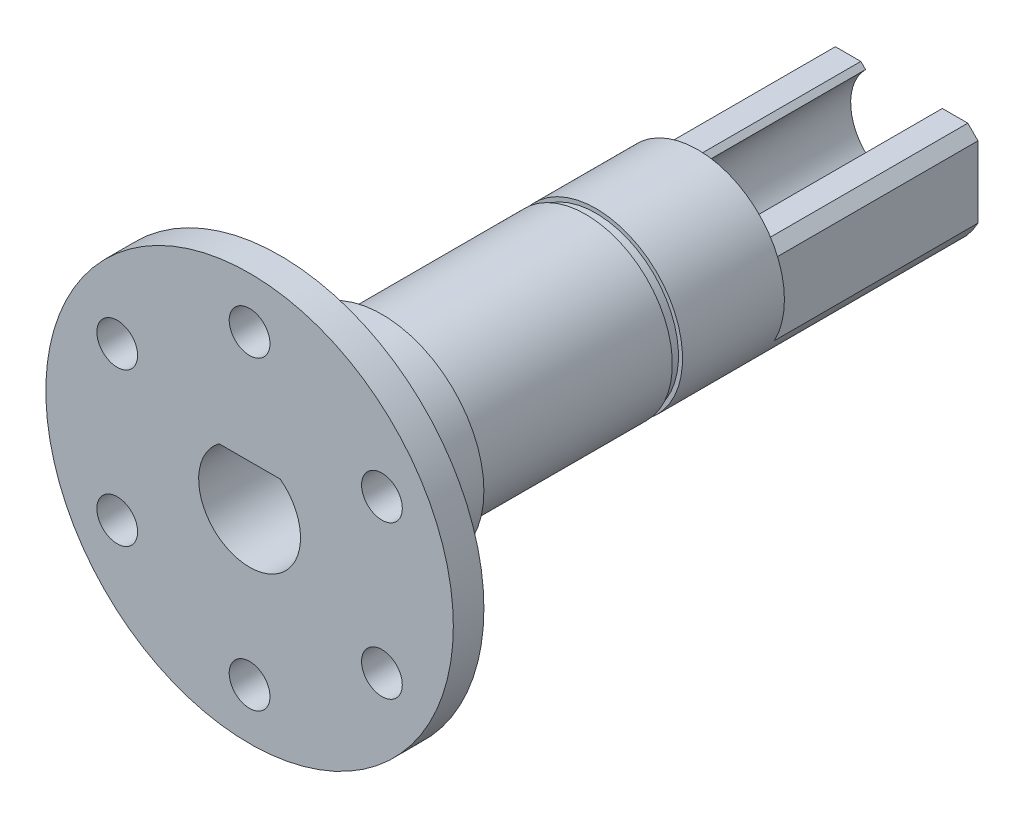
ISO-10303-21;
HEADER;
FILE_DESCRIPTION(('STEP AP214'),'2;1');
FILE_NAME('part.step','',(''),(''),'','','');
FILE_SCHEMA(('AUTOMOTIVE_DESIGN { 1 0 10303 214 1 1 1 1 }'));
ENDSEC;
DATA;
#1=APPLICATION_CONTEXT('core data for automotive mechanical design processes');
#2=APPLICATION_PROTOCOL_DEFINITION('international standard','automotive_design',2000,#1);
#3=PRODUCT_CONTEXT('',#1,'mechanical');
#4=PRODUCT('Part','Part','',(#3));
#5=PRODUCT_RELATED_PRODUCT_CATEGORY('part','',(#4));
#6=PRODUCT_DEFINITION_FORMATION('','',#4);
#7=PRODUCT_DEFINITION_CONTEXT('part definition',#1,'design');
#8=PRODUCT_DEFINITION('design','',#6,#7);
#9=PRODUCT_DEFINITION_SHAPE('','',#8);
#10=(LENGTH_UNIT() NAMED_UNIT(*) SI_UNIT(.MILLI.,.METRE.));
#11=(NAMED_UNIT(*) PLANE_ANGLE_UNIT() SI_UNIT($,.RADIAN.));
#12=(NAMED_UNIT(*) SI_UNIT($,.STERADIAN.) SOLID_ANGLE_UNIT());
#13=UNCERTAINTY_MEASURE_WITH_UNIT(LENGTH_MEASURE(1.E-05),#10,'distance_accuracy_value','');
#14=(GEOMETRIC_REPRESENTATION_CONTEXT(3) GLOBAL_UNCERTAINTY_ASSIGNED_CONTEXT((#13)) GLOBAL_UNIT_ASSIGNED_CONTEXT((#10,
#11,#12)) REPRESENTATION_CONTEXT('',''));
#15=CARTESIAN_POINT('',(0.,0.,0.));
#16=DIRECTION('',(0.,0.,1.));
#17=DIRECTION('',(1.,0.,0.));
#18=AXIS2_PLACEMENT_3D('',#15,#16,#17);
#19=CARTESIAN_POINT('',(3.,4.,77.));
#20=DIRECTION('',(0.,-1.,0.));
#21=DIRECTION('',(0.,0.,-1.));
#22=AXIS2_PLACEMENT_3D('',#19,#20,#21);
#23=PLANE('',#22);
#24=DIRECTION('',(0.,0.,-1.));
#25=VECTOR('',#24,1.);
#26=CARTESIAN_POINT('',(-3.,4.,77.));
#27=LINE('',#26,#25);
#28=CARTESIAN_POINT('',(-3.,4.,57.));
#29=VERTEX_POINT('',#28);
#30=CARTESIAN_POINT('',(-3.,4.,13.));
#31=VERTEX_POINT('',#30);
#32=EDGE_CURVE('E305',#29,#31,#27,.T.);
#33=ORIENTED_EDGE('',*,*,#32,.T.);
#34=DIRECTION('',(-1.,0.,0.));
#35=VECTOR('',#34,1.);
#36=CARTESIAN_POINT('',(7.5,4.,13.));
#37=LINE('',#36,#35);
#38=CARTESIAN_POINT('',(3.,4.,13.));
#39=VERTEX_POINT('',#38);
#40=EDGE_CURVE('E362',#39,#31,#37,.T.);
#41=ORIENTED_EDGE('',*,*,#40,.F.);
#42=DIRECTION('',(0.,0.,-1.));
#43=VECTOR('',#42,1.);
#44=CARTESIAN_POINT('',(3.,4.,77.));
#45=LINE('',#44,#43);
#46=CARTESIAN_POINT('',(3.,4.,57.));
#47=VERTEX_POINT('',#46);
#48=EDGE_CURVE('E309',#47,#39,#45,.T.);
#49=ORIENTED_EDGE('',*,*,#48,.F.);
#50=DIRECTION('',(-1.,0.,0.));
#51=VECTOR('',#50,1.);
#52=CARTESIAN_POINT('',(3.,4.,57.));
#53=LINE('',#52,#51);
#54=EDGE_CURVE('E200',#47,#29,#53,.T.);
#55=ORIENTED_EDGE('',*,*,#54,.T.);
#56=EDGE_LOOP('',(#33,#41,#49,#55));
#57=FACE_BOUND('',#56,.T.);
#58=ADVANCED_FACE('F38',(#57),#23,.T.);
#59=CARTESIAN_POINT('',(0.,0.,20.));
#60=DIRECTION('',(0.,0.,-1.));
#61=DIRECTION('',(-1.,0.,0.));
#62=AXIS2_PLACEMENT_3D('',#59,#60,#61);
#63=CYLINDRICAL_SURFACE('',#62,5.);
#64=CARTESIAN_POINT('',(0.,-5.,1.5));
#65=CARTESIAN_POINT('',(-0.0822886127533,-4.9999992925055,1.50000099748489));
#66=CARTESIAN_POINT('',(-0.164587318351529,-4.99794915693954,1.50679386362397));
#67=CARTESIAN_POINT('',(-0.326788125304881,-4.98997105593691,1.5337213542221));
#68=CARTESIAN_POINT('',(-0.40668950441142,-4.98404193389692,1.55385995802334));
#69=CARTESIAN_POINT('',(-0.561732707754527,-4.96895552501836,1.60674601691026));
#70=CARTESIAN_POINT('',(-0.636881364395373,-4.95980300250425,1.63947486961894));
#71=CARTESIAN_POINT('',(-0.780624181053131,-4.93922109237645,1.71653609305584));
#72=CARTESIAN_POINT('',(-0.849217467469669,-4.92779140192067,1.76087000739542));
#73=CARTESIAN_POINT('',(-0.979871797183745,-4.90350737192774,1.86122400747267));
#74=CARTESIAN_POINT('',(-1.04171807124434,-4.89062383657036,1.91751662588591));
#75=CARTESIAN_POINT('',(-1.15524920923324,-4.86505834210442,2.03960922991018));
#76=CARTESIAN_POINT('',(-1.20693236327441,-4.85237641724501,2.10541081212496));
#77=CARTESIAN_POINT('',(-1.29980037723708,-4.82834113993772,2.24647075303761));
#78=CARTESIAN_POINT('',(-1.34072309022213,-4.81702406663875,2.32190846099074));
#79=CARTESIAN_POINT('',(-1.4092139477476,-4.79743620394031,2.47898925423029));
#80=CARTESIAN_POINT('',(-1.43678529919973,-4.78916468313311,2.56063084392798));
#81=CARTESIAN_POINT('',(-1.47701633682652,-4.77690870838434,2.72539026613046));
#82=CARTESIAN_POINT('',(-1.49007196234677,-4.77281069324533,2.80840274386394));
#83=CARTESIAN_POINT('',(-1.50213730614672,-4.76902789749767,2.97553315621677));
#84=CARTESIAN_POINT('',(-1.50115042761078,-4.76934204760571,3.05965081805909));
#85=CARTESIAN_POINT('',(-1.48546977199812,-4.77424744067778,3.22338390860848));
#86=CARTESIAN_POINT('',(-1.47127205262685,-4.7786838859914,3.30305225036224));
#87=CARTESIAN_POINT('',(-1.43037420427056,-4.79108356228624,3.45881978627346));
#88=CARTESIAN_POINT('',(-1.40367284141641,-4.79904714132351,3.53491862737433));
#89=CARTESIAN_POINT('',(-1.33816026653682,-4.81772733074973,3.68260034966074));
#90=CARTESIAN_POINT('',(-1.29918816934642,-4.82848016115952,3.75410708395526));
#91=CARTESIAN_POINT('',(-1.21035222588683,-4.85150987000065,3.88973202201019));
#92=CARTESIAN_POINT('',(-1.16048574002588,-4.86378711746991,3.95384842941378));
#93=CARTESIAN_POINT('',(-1.04881290765546,-4.88911011297937,4.07568619076202));
#94=CARTESIAN_POINT('',(-0.986594907466971,-4.90216654310498,4.13302866402967));
#95=CARTESIAN_POINT('',(-0.853263259313966,-4.92712244063259,4.23655398406425));
#96=CARTESIAN_POINT('',(-0.782149051860887,-4.9390218351841,4.28273612841443));
#97=CARTESIAN_POINT('',(-0.632355038342802,-4.9604316006947,4.36285992246473));
#98=CARTESIAN_POINT('',(-0.55362774974795,-4.96992543668314,4.39671751624986));
#99=CARTESIAN_POINT('',(-0.391245415603518,-4.98533521832222,4.45059959009963));
#100=CARTESIAN_POINT('',(-0.307591751589581,-4.99125216186999,4.47062792853249));
#101=CARTESIAN_POINT('',(-0.140952242668331,-4.99868364643538,4.4956521778994));
#102=CARTESIAN_POINT('',(-0.0580500976011863,-5.0003485041779,4.50116158580161));
#103=CARTESIAN_POINT('',(0.107499605823384,-4.9995292324176,4.49843084428792));
#104=CARTESIAN_POINT('',(0.190147196690781,-4.99704565677756,4.49019253034856));
#105=CARTESIAN_POINT('',(0.350903605309697,-4.98830696987163,4.46061538888851));
#106=CARTESIAN_POINT('',(0.42907277261417,-4.98213829799417,4.43957661241913));
#107=CARTESIAN_POINT('',(0.580754638954522,-4.96674347841533,4.3853567672218));
#108=CARTESIAN_POINT('',(0.654266777025584,-4.95751696321085,4.35217423896214));
#109=CARTESIAN_POINT('',(0.796437189461052,-4.93669654351325,4.27374683451887));
#110=CARTESIAN_POINT('',(0.86494382619967,-4.92505280829675,4.22824065905203));
#111=CARTESIAN_POINT('',(0.993523307980147,-4.90073468764318,4.12677524594719));
#112=CARTESIAN_POINT('',(1.05359403235593,-4.8880600443108,4.07081338811233));
#113=CARTESIAN_POINT('',(1.16585744551027,-4.86253171869138,3.94761269163066));
#114=CARTESIAN_POINT('',(1.21768481231504,-4.84968825033268,3.88003812422826));
#115=CARTESIAN_POINT('',(1.30928995072154,-4.82576515238463,3.73687206098647));
#116=CARTESIAN_POINT('',(1.34906803829472,-4.81468547654651,3.66128077544179));
#117=CARTESIAN_POINT('',(1.41517347127168,-4.79567189615055,3.50446750874531));
#118=CARTESIAN_POINT('',(1.4415634693705,-4.78772337843827,3.42327381346341));
#119=CARTESIAN_POINT('',(1.48021730815114,-4.77591594362794,3.25731203106852));
#120=CARTESIAN_POINT('',(1.49248598978779,-4.772055625083,3.17254517921233));
#121=CARTESIAN_POINT('',(1.50221984485059,-4.76899972496087,3.00563848162377));
#122=CARTESIAN_POINT('',(1.5002805530849,-4.76961647442754,2.92353634898241));
#123=CARTESIAN_POINT('',(1.48307505444813,-4.77499401288294,2.7608858966272));
#124=CARTESIAN_POINT('',(1.46780938124716,-4.77975463592551,2.68033751482365));
#125=CARTESIAN_POINT('',(1.42476888804136,-4.79275763670385,2.52405460085715));
#126=CARTESIAN_POINT('',(1.39715175507068,-4.80095604545965,2.44827271263831));
#127=CARTESIAN_POINT('',(1.33031507121129,-4.81990278909136,2.30235756118228));
#128=CARTESIAN_POINT('',(1.29109329962876,-4.83065161194312,2.23222538235924));
#129=CARTESIAN_POINT('',(1.20048763805072,-4.85397676425833,2.09683688347289));
#130=CARTESIAN_POINT('',(1.14871276092994,-4.86660540163798,2.03185123873959));
#131=CARTESIAN_POINT('',(1.03517434629782,-4.89201320450026,1.91129750169214));
#132=CARTESIAN_POINT('',(0.973408217134501,-4.90479240823905,1.85573186053224));
#133=CARTESIAN_POINT('',(0.839465762183248,-4.92950936570649,1.75397658770497));
#134=CARTESIAN_POINT('',(0.767037885790608,-4.94141159765674,1.70810855314451));
#135=CARTESIAN_POINT('',(0.61514137398353,-4.96260680455813,1.62926483009598));
#136=CARTESIAN_POINT('',(0.535676052998955,-4.97190099931067,1.59628311172549));
#137=CARTESIAN_POINT('',(0.380757712655281,-4.98602174969301,1.54710472434725));
#138=CARTESIAN_POINT('',(0.305786961954234,-4.99122027381068,1.52948832711675));
#139=CARTESIAN_POINT('',(0.153880195230779,-4.99820944494492,1.50593647475842));
#140=CARTESIAN_POINT('',(0.0769445098581395,-5.0000006615474,1.49999906729518));
#141=CARTESIAN_POINT('',(0.,-5.,1.5));
#142=B_SPLINE_CURVE_WITH_KNOTS('',3,(#64,#65,#66,#67,#68,#69,#70,#71,#72,#73,#74,#75,#76,#77,
#78,#79,#80,#81,#82,#83,#84,#85,#86,#87,#88,#89,#90,#91,#92,#93,#94,#95,#96,#97,#98,#99,#100,
#101,#102,#103,#104,#105,#106,#107,#108,#109,#110,#111,#112,#113,#114,#115,#116,#117,#118,#119,
#120,#121,#122,#123,#124,#125,#126,#127,#128,#129,#130,#131,#132,#133,#134,#135,#136,#137,#138,
#139,#140,#141),.UNSPECIFIED.,.T.,.F.,(4,2,2,2,2,2,2,2,2,2,2,2,2,2,2,2,2,2,2,2,2,2,2,2,2,2,2,2,
2,2,2,2,2,2,2,2,2,2,4),(0.,0.246583203612611,0.493239964845999,0.739533676300874,
0.985860164412702,1.23855602948191,1.49129437288633,1.74971481004109,2.00807314543224,
2.25919689356599,2.51025978319089,2.75226016697676,2.99428443658001,3.23962426447119,
3.48502360158555,3.74067104048167,3.99633456531072,4.25371046881689,4.51101453528808,
4.75908809438545,5.00712853550327,5.24956746682327,5.49203554593729,5.74011305702908,
5.98825282000191,6.24540400322819,6.50254844252681,6.75847814951252,7.01432009460283,
7.25950155466943,7.504673196616,7.74680040402721,7.98897397553107,8.23996925679931,
8.49102974897503,8.74942996156671,9.00770911595235,9.2383169193046,9.46888616948875),.UNSPECIFIED.);
#143=CARTESIAN_POINT('',(0.,-5.,1.5));
#144=VERTEX_POINT('',#143);
#145=EDGE_CURVE('E201',#144,#144,#142,.T.);
#146=ORIENTED_EDGE('',*,*,#145,.F.);
#147=EDGE_LOOP('',(#146));
#148=FACE_BOUND('',#147,.T.);
#149=CARTESIAN_POINT('',(0.,0.,-7.));
#150=DIRECTION('',(0.,0.,-1.));
#151=DIRECTION('',(-1.,0.,0.));
#152=AXIS2_PLACEMENT_3D('',#149,#150,#151);
#153=CIRCLE('',#152,5.);
#154=CARTESIAN_POINT('',(3.53553390593274,3.53553390593273,-7.));
#155=VERTEX_POINT('',#154);
#156=CARTESIAN_POINT('',(-3.53553390593274,3.53553390593273,-7.));
#157=VERTEX_POINT('',#156);
#158=EDGE_CURVE('E179',#155,#157,#153,.T.);
#159=ORIENTED_EDGE('',*,*,#158,.T.);
#160=DIRECTION('',(0.,0.,-1.));
#161=VECTOR('',#160,1.);
#162=CARTESIAN_POINT('',(-3.53553390593274,3.53553390593273,20.));
#163=LINE('',#162,#161);
#164=CARTESIAN_POINT('',(-3.53553390593274,3.53553390593273,13.));
#165=VERTEX_POINT('',#164);
#166=EDGE_CURVE('E359',#157,#165,#163,.F.);
#167=ORIENTED_EDGE('',*,*,#166,.T.);
#168=CARTESIAN_POINT('',(0.,0.,13.));
#169=DIRECTION('',(0.,0.,1.));
#170=DIRECTION('',(1.,0.,0.));
#171=AXIS2_PLACEMENT_3D('',#168,#169,#170);
#172=CIRCLE('',#171,5.);
#173=EDGE_CURVE('E357',#165,#31,#172,.F.);
#174=ORIENTED_EDGE('',*,*,#173,.T.);
#175=ORIENTED_EDGE('',*,*,#32,.F.);
#176=CARTESIAN_POINT('',(0.,0.,57.));
#177=DIRECTION('',(0.,0.,1.));
#178=DIRECTION('',(1.,0.,0.));
#179=AXIS2_PLACEMENT_3D('',#176,#177,#178);
#180=CIRCLE('',#179,5.);
#181=EDGE_CURVE('E345',#47,#29,#180,.F.);
#182=ORIENTED_EDGE('',*,*,#181,.F.);
#183=ORIENTED_EDGE('',*,*,#48,.T.);
#184=CARTESIAN_POINT('',(0.,0.,13.));
#185=DIRECTION('',(0.,0.,1.));
#186=DIRECTION('',(1.,0.,0.));
#187=AXIS2_PLACEMENT_3D('',#184,#185,#186);
#188=CIRCLE('',#187,5.);
#189=CARTESIAN_POINT('',(3.53553390593274,3.53553390593273,13.));
#190=VERTEX_POINT('',#189);
#191=EDGE_CURVE('E52',#39,#190,#188,.F.);
#192=ORIENTED_EDGE('',*,*,#191,.T.);
#193=DIRECTION('',(0.,0.,-1.));
#194=VECTOR('',#193,1.);
#195=CARTESIAN_POINT('',(3.53553390593274,3.53553390593273,20.));
#196=LINE('',#195,#194);
#197=EDGE_CURVE('E360',#190,#155,#196,.T.);
#198=ORIENTED_EDGE('',*,*,#197,.T.);
#199=EDGE_LOOP('',(#159,#167,#174,#175,#182,#183,#192,#198));
#200=FACE_BOUND('',#199,.T.);
#201=ADVANCED_FACE('F210',(#148,#200),#63,.F.);
#202=CARTESIAN_POINT('',(0.,0.,57.));
#203=DIRECTION('',(0.,0.,1.));
#204=DIRECTION('',(1.,0.,0.));
#205=AXIS2_PLACEMENT_3D('',#202,#203,#204);
#206=PLANE('',#205);
#207=CARTESIAN_POINT('',(-12.9903810567662,7.49999999999925,57.));
#208=DIRECTION('',(0.,0.,1.));
#209=DIRECTION('',(1.,0.,0.));
#210=AXIS2_PLACEMENT_3D('',#207,#208,#209);
#211=CIRCLE('',#210,2.0000000000008);
#212=CARTESIAN_POINT('',(-10.9903810567654,7.49999999999925,57.));
#213=VERTEX_POINT('',#212);
#214=EDGE_CURVE('E304',#213,#213,#211,.T.);
#215=ORIENTED_EDGE('',*,*,#214,.F.);
#216=EDGE_LOOP('',(#215));
#217=FACE_BOUND('',#216,.T.);
#218=CARTESIAN_POINT('',(1.7016286254268E-12,-15.,57.));
#219=DIRECTION('',(0.,0.,1.));
#220=DIRECTION('',(1.,0.,0.));
#221=AXIS2_PLACEMENT_3D('',#218,#219,#220);
#222=CIRCLE('',#221,2.00000000000188);
#223=CARTESIAN_POINT('',(2.00000000000358,-15.,57.));
#224=VERTEX_POINT('',#223);
#225=EDGE_CURVE('E317',#224,#224,#222,.T.);
#226=ORIENTED_EDGE('',*,*,#225,.F.);
#227=EDGE_LOOP('',(#226));
#228=FACE_BOUND('',#227,.T.);
#229=CARTESIAN_POINT('',(12.9903810567669,7.50000000000037,57.));
#230=DIRECTION('',(0.,0.,1.));
#231=DIRECTION('',(1.,0.,0.));
#232=AXIS2_PLACEMENT_3D('',#229,#230,#231);
#233=CIRCLE('',#232,2.00000000000033);
#234=CARTESIAN_POINT('',(14.9903810567672,7.50000000000037,57.));
#235=VERTEX_POINT('',#234);
#236=EDGE_CURVE('E325',#235,#235,#233,.T.);
#237=ORIENTED_EDGE('',*,*,#236,.F.);
#238=EDGE_LOOP('',(#237));
#239=FACE_BOUND('',#238,.T.);
#240=CARTESIAN_POINT('',(0.,0.,57.));
#241=DIRECTION('',(0.,0.,1.));
#242=DIRECTION('',(1.,0.,0.));
#243=AXIS2_PLACEMENT_3D('',#240,#241,#242);
#244=CIRCLE('',#243,20.);
#245=CARTESIAN_POINT('',(20.,0.,57.));
#246=VERTEX_POINT('',#245);
#247=EDGE_CURVE('E208',#246,#246,#244,.T.);
#248=ORIENTED_EDGE('',*,*,#247,.T.);
#249=EDGE_LOOP('',(#248));
#250=FACE_BOUND('',#249,.T.);
#251=CARTESIAN_POINT('',(0.,15.,57.));
#252=DIRECTION('',(0.,0.,1.));
#253=DIRECTION('',(1.,0.,0.));
#254=AXIS2_PLACEMENT_3D('',#251,#252,#253);
#255=CIRCLE('',#254,2.);
#256=CARTESIAN_POINT('',(2.,15.,57.));
#257=VERTEX_POINT('',#256);
#258=EDGE_CURVE('E329',#257,#257,#255,.T.);
#259=ORIENTED_EDGE('',*,*,#258,.F.);
#260=EDGE_LOOP('',(#259));
#261=FACE_BOUND('',#260,.T.);
#262=CARTESIAN_POINT('',(12.9903810567679,-7.49999999999926,57.));
#263=DIRECTION('',(0.,0.,1.));
#264=DIRECTION('',(1.,0.,0.));
#265=AXIS2_PLACEMENT_3D('',#262,#263,#264);
#266=CIRCLE('',#265,2.00000000000138);
#267=CARTESIAN_POINT('',(14.9903810567692,-7.49999999999926,57.));
#268=VERTEX_POINT('',#267);
#269=EDGE_CURVE('E321',#268,#268,#266,.T.);
#270=ORIENTED_EDGE('',*,*,#269,.F.);
#271=EDGE_LOOP('',(#270));
#272=FACE_BOUND('',#271,.T.);
#273=CARTESIAN_POINT('',(-12.9903810567653,-7.50000000000074,57.));
#274=DIRECTION('',(0.,0.,1.));
#275=DIRECTION('',(1.,0.,0.));
#276=AXIS2_PLACEMENT_3D('',#273,#274,#275);
#277=CIRCLE('',#276,2.00000000000158);
#278=CARTESIAN_POINT('',(-10.9903810567637,-7.50000000000074,57.));
#279=VERTEX_POINT('',#278);
#280=EDGE_CURVE('E313',#279,#279,#277,.T.);
#281=ORIENTED_EDGE('',*,*,#280,.F.);
#282=EDGE_LOOP('',(#281));
#283=FACE_BOUND('',#282,.T.);
#284=ORIENTED_EDGE('',*,*,#181,.T.);
#285=ORIENTED_EDGE('',*,*,#54,.F.);
#286=EDGE_LOOP('',(#284,#285));
#287=FACE_BOUND('',#286,.T.);
#288=ADVANCED_FACE('F235',(#217,#228,#239,#250,#261,#272,#283,#287),#206,.T.);
#289=CARTESIAN_POINT('',(0.,0.,33.));
#290=DIRECTION('',(0.,0.,-1.));
#291=DIRECTION('',(-1.,0.,0.));
#292=AXIS2_PLACEMENT_3D('',#289,#290,#291);
#293=CYLINDRICAL_SURFACE('',#292,8.5);
#294=CARTESIAN_POINT('',(0.,0.,23.));
#295=DIRECTION('',(0.,0.,-1.));
#296=DIRECTION('',(-1.,0.,0.));
#297=AXIS2_PLACEMENT_3D('',#294,#295,#296);
#298=CIRCLE('',#297,8.5);
#299=CARTESIAN_POINT('',(-8.5,0.,23.));
#300=VERTEX_POINT('',#299);
#301=EDGE_CURVE('E185',#300,#300,#298,.T.);
#302=ORIENTED_EDGE('',*,*,#301,.T.);
#303=EDGE_LOOP('',(#302));
#304=FACE_BOUND('',#303,.T.);
#305=CARTESIAN_POINT('',(0.,0.,13.));
#306=DIRECTION('',(0.,0.,-1.));
#307=DIRECTION('',(-1.,0.,0.));
#308=AXIS2_PLACEMENT_3D('',#305,#306,#307);
#309=CIRCLE('',#308,8.5);
#310=CARTESIAN_POINT('',(4.82182538049648,-7.,13.));
#311=VERTEX_POINT('',#310);
#312=CARTESIAN_POINT('',(-4.82182538049648,-7.,13.));
#313=VERTEX_POINT('',#312);
#314=EDGE_CURVE('E165',#311,#313,#309,.T.);
#315=ORIENTED_EDGE('',*,*,#314,.F.);
#316=DIRECTION('',(0.,0.,-1.));
#317=VECTOR('',#316,1.);
#318=CARTESIAN_POINT('',(4.82182538049648,-7.,33.));
#319=LINE('',#318,#317);
#320=CARTESIAN_POINT('',(4.82182538049648,-7.,-7.));
#321=VERTEX_POINT('',#320);
#322=EDGE_CURVE('E149',#311,#321,#319,.T.);
#323=ORIENTED_EDGE('',*,*,#322,.T.);
#324=CARTESIAN_POINT('',(0.,0.,-7.));
#325=DIRECTION('',(0.,0.,-1.));
#326=DIRECTION('',(-1.,0.,0.));
#327=AXIS2_PLACEMENT_3D('',#324,#325,#326);
#328=CIRCLE('',#327,8.5);
#329=CARTESIAN_POINT('',(7.5,-4.,-7.));
#330=VERTEX_POINT('',#329);
#331=EDGE_CURVE('E164',#330,#321,#328,.T.);
#332=ORIENTED_EDGE('',*,*,#331,.F.);
#333=DIRECTION('',(0.,0.,-1.));
#334=VECTOR('',#333,1.);
#335=CARTESIAN_POINT('',(7.5,-4.,13.));
#336=LINE('',#335,#334);
#337=CARTESIAN_POINT('',(7.5,-4.,13.));
#338=VERTEX_POINT('',#337);
#339=EDGE_CURVE('E404',#338,#330,#336,.T.);
#340=ORIENTED_EDGE('',*,*,#339,.F.);
#341=CARTESIAN_POINT('',(0.,0.,13.));
#342=DIRECTION('',(0.,0.,1.));
#343=DIRECTION('',(1.,0.,0.));
#344=AXIS2_PLACEMENT_3D('',#341,#342,#343);
#345=CIRCLE('',#344,8.5);
#346=CARTESIAN_POINT('',(7.5,4.,13.));
#347=VERTEX_POINT('',#346);
#348=EDGE_CURVE('E446',#338,#347,#345,.T.);
#349=ORIENTED_EDGE('',*,*,#348,.T.);
#350=CARTESIAN_POINT('',(0.,0.,13.));
#351=DIRECTION('',(0.,0.,-1.));
#352=DIRECTION('',(-1.,0.,0.));
#353=AXIS2_PLACEMENT_3D('',#350,#351,#352);
#354=CIRCLE('',#353,8.5);
#355=CARTESIAN_POINT('',(-7.5,4.,13.));
#356=VERTEX_POINT('',#355);
#357=EDGE_CURVE('E353',#356,#347,#354,.T.);
#358=ORIENTED_EDGE('',*,*,#357,.F.);
#359=CARTESIAN_POINT('',(0.,0.,13.));
#360=DIRECTION('',(0.,0.,-1.));
#361=DIRECTION('',(-1.,0.,0.));
#362=AXIS2_PLACEMENT_3D('',#359,#360,#361);
#363=CIRCLE('',#362,8.5);
#364=CARTESIAN_POINT('',(-7.5,-4.,13.));
#365=VERTEX_POINT('',#364);
#366=EDGE_CURVE('E422',#365,#356,#363,.T.);
#367=ORIENTED_EDGE('',*,*,#366,.F.);
#368=DIRECTION('',(0.,0.,-1.));
#369=VECTOR('',#368,1.);
#370=CARTESIAN_POINT('',(-7.5,-4.,13.));
#371=LINE('',#370,#369);
#372=CARTESIAN_POINT('',(-7.5,-4.,-7.));
#373=VERTEX_POINT('',#372);
#374=EDGE_CURVE('E370',#365,#373,#371,.T.);
#375=ORIENTED_EDGE('',*,*,#374,.T.);
#376=CARTESIAN_POINT('',(-4.82182538049648,-7.,-7.));
#377=VERTEX_POINT('',#376);
#378=EDGE_CURVE('E174',#377,#373,#328,.T.);
#379=ORIENTED_EDGE('',*,*,#378,.F.);
#380=DIRECTION('',(0.,0.,-1.));
#381=VECTOR('',#380,1.);
#382=CARTESIAN_POINT('',(-4.82182538049648,-7.,33.));
#383=LINE('',#382,#381);
#384=EDGE_CURVE('E152',#377,#313,#383,.F.);
#385=ORIENTED_EDGE('',*,*,#384,.T.);
#386=EDGE_LOOP('',(#315,#323,#332,#340,#349,#358,#367,#375,#379,#385));
#387=FACE_BOUND('',#386,.T.);
#388=ADVANCED_FACE('F162',(#304,#387),#293,.T.);
#389=CARTESIAN_POINT('',(0.,0.,24.));
#390=DIRECTION('',(0.,0.,-1.));
#391=DIRECTION('',(-1.,0.,0.));
#392=AXIS2_PLACEMENT_3D('',#389,#390,#391);
#393=CIRCLE('',#392,8.5);
#394=CARTESIAN_POINT('',(-8.5,0.,24.));
#395=VERTEX_POINT('',#394);
#396=EDGE_CURVE('E177',#395,#395,#393,.T.);
#397=ORIENTED_EDGE('',*,*,#396,.F.);
#398=EDGE_LOOP('',(#397));
#399=FACE_BOUND('',#398,.T.);
#400=CARTESIAN_POINT('',(0.,0.,44.));
#401=DIRECTION('',(0.,0.,1.));
#402=DIRECTION('',(1.,0.,0.));
#403=AXIS2_PLACEMENT_3D('',#400,#401,#402);
#404=CIRCLE('',#403,8.5);
#405=CARTESIAN_POINT('',(8.5,0.,44.));
#406=VERTEX_POINT('',#405);
#407=EDGE_CURVE('E195',#406,#406,#404,.T.);
#408=ORIENTED_EDGE('',*,*,#407,.F.);
#409=EDGE_LOOP('',(#408));
#410=FACE_BOUND('',#409,.T.);
#411=ADVANCED_FACE('F530',(#399,#410),#293,.T.);
#412=CARTESIAN_POINT('',(0.,0.,54.));
#413=DIRECTION('',(0.,0.,-1.));
#414=DIRECTION('',(-1.,0.,0.));
#415=AXIS2_PLACEMENT_3D('',#412,#413,#414);
#416=CYLINDRICAL_SURFACE('',#415,10.);
#417=CARTESIAN_POINT('',(0.,0.,54.));
#418=DIRECTION('',(0.,0.,1.));
#419=DIRECTION('',(1.,0.,0.));
#420=AXIS2_PLACEMENT_3D('',#417,#418,#419);
#421=CIRCLE('',#420,10.);
#422=CARTESIAN_POINT('',(10.,0.,54.));
#423=VERTEX_POINT('',#422);
#424=EDGE_CURVE('E192',#423,#423,#421,.T.);
#425=ORIENTED_EDGE('',*,*,#424,.F.);
#426=EDGE_LOOP('',(#425));
#427=FACE_BOUND('',#426,.T.);
#428=CARTESIAN_POINT('',(0.,0.,44.));
#429=DIRECTION('',(0.,0.,1.));
#430=DIRECTION('',(1.,0.,0.));
#431=AXIS2_PLACEMENT_3D('',#428,#429,#430);
#432=CIRCLE('',#431,10.);
#433=CARTESIAN_POINT('',(10.,0.,44.));
#434=VERTEX_POINT('',#433);
#435=EDGE_CURVE('E191',#434,#434,#432,.T.);
#436=ORIENTED_EDGE('',*,*,#435,.T.);
#437=EDGE_LOOP('',(#436));
#438=FACE_BOUND('',#437,.T.);
#439=ADVANCED_FACE('F535',(#427,#438),#416,.T.);
#440=CARTESIAN_POINT('',(0.,0.,44.));
#441=DIRECTION('',(0.,0.,1.));
#442=DIRECTION('',(1.,0.,0.));
#443=AXIS2_PLACEMENT_3D('',#440,#441,#442);
#444=PLANE('',#443);
#445=ORIENTED_EDGE('',*,*,#407,.T.);
#446=EDGE_LOOP('',(#445));
#447=FACE_BOUND('',#446,.T.);
#448=ORIENTED_EDGE('',*,*,#435,.F.);
#449=EDGE_LOOP('',(#448));
#450=FACE_BOUND('',#449,.T.);
#451=ADVANCED_FACE('F522',(#447,#450),#444,.F.);
#452=CARTESIAN_POINT('',(0.,0.,0.));
#453=DIRECTION('',(0.,0.,-1.));
#454=DIRECTION('',(-1.,0.,0.));
#455=AXIS2_PLACEMENT_3D('',#452,#453,#454);
#456=CYLINDRICAL_SURFACE('',#455,8.1);
#457=CARTESIAN_POINT('',(0.,0.,23.));
#458=DIRECTION('',(0.,0.,-1.));
#459=DIRECTION('',(-1.,0.,0.));
#460=AXIS2_PLACEMENT_3D('',#457,#458,#459);
#461=CIRCLE('',#460,8.1);
#462=CARTESIAN_POINT('',(-8.1,0.,23.));
#463=VERTEX_POINT('',#462);
#464=EDGE_CURVE('E188',#463,#463,#461,.T.);
#465=ORIENTED_EDGE('',*,*,#464,.F.);
#466=EDGE_LOOP('',(#465));
#467=FACE_BOUND('',#466,.T.);
#468=CARTESIAN_POINT('',(0.,0.,24.));
#469=DIRECTION('',(0.,0.,-1.));
#470=DIRECTION('',(-1.,0.,0.));
#471=AXIS2_PLACEMENT_3D('',#468,#469,#470);
#472=CIRCLE('',#471,8.1);
#473=CARTESIAN_POINT('',(-8.1,0.,24.));
#474=VERTEX_POINT('',#473);
#475=EDGE_CURVE('E173',#474,#474,#472,.T.);
#476=ORIENTED_EDGE('',*,*,#475,.T.);
#477=EDGE_LOOP('',(#476));
#478=FACE_BOUND('',#477,.T.);
#479=ADVANCED_FACE('F512',(#467,#478),#456,.T.);
#480=CARTESIAN_POINT('',(0.,8.1,23.));
#481=DIRECTION('',(0.,0.,-1.));
#482=DIRECTION('',(-1.,0.,0.));
#483=AXIS2_PLACEMENT_3D('',#480,#481,#482);
#484=PLANE('',#483);
#485=ORIENTED_EDGE('',*,*,#301,.F.);
#486=EDGE_LOOP('',(#485));
#487=FACE_BOUND('',#486,.T.);
#488=ORIENTED_EDGE('',*,*,#464,.T.);
#489=EDGE_LOOP('',(#488));
#490=FACE_BOUND('',#489,.T.);
#491=ADVANCED_FACE('F227',(#487,#490),#484,.F.);
#492=CARTESIAN_POINT('',(0.,8.1,24.));
#493=DIRECTION('',(0.,0.,1.));
#494=DIRECTION('',(1.,0.,0.));
#495=AXIS2_PLACEMENT_3D('',#492,#493,#494);
#496=PLANE('',#495);
#497=ORIENTED_EDGE('',*,*,#475,.F.);
#498=EDGE_LOOP('',(#497));
#499=FACE_BOUND('',#498,.T.);
#500=ORIENTED_EDGE('',*,*,#396,.T.);
#501=EDGE_LOOP('',(#500));
#502=FACE_BOUND('',#501,.T.);
#503=ADVANCED_FACE('F223',(#499,#502),#496,.F.);
#504=CARTESIAN_POINT('',(0.,0.,-7.));
#505=DIRECTION('',(0.,0.,-1.));
#506=DIRECTION('',(-1.,0.,0.));
#507=AXIS2_PLACEMENT_3D('',#504,#505,#506);
#508=PLANE('',#507);
#509=DIRECTION('',(-1.,0.,0.));
#510=VECTOR('',#509,1.);
#511=CARTESIAN_POINT('',(7.5,4.,-7.));
#512=LINE('',#511,#510);
#513=CARTESIAN_POINT('',(-4.00000000000001,4.,-7.));
#514=VERTEX_POINT('',#513);
#515=CARTESIAN_POINT('',(-6.49999999999999,4.,-7.));
#516=VERTEX_POINT('',#515);
#517=EDGE_CURVE('E372',#514,#516,#512,.T.);
#518=ORIENTED_EDGE('',*,*,#517,.F.);
#519=DIRECTION('',(0.70710678118655,-0.707106781186546,0.));
#520=VECTOR('',#519,1.);
#521=CARTESIAN_POINT('',(0.,0.,-7.));
#522=LINE('',#521,#520);
#523=EDGE_CURVE('E388',#514,#157,#522,.T.);
#524=ORIENTED_EDGE('',*,*,#523,.T.);
#525=ORIENTED_EDGE('',*,*,#158,.F.);
#526=DIRECTION('',(-0.70710678118655,-0.707106781186546,0.));
#527=VECTOR('',#526,1.);
#528=CARTESIAN_POINT('',(0.,0.,-7.));
#529=LINE('',#528,#527);
#530=CARTESIAN_POINT('',(4.00000000000001,4.,-7.));
#531=VERTEX_POINT('',#530);
#532=EDGE_CURVE('E380',#155,#531,#529,.F.);
#533=ORIENTED_EDGE('',*,*,#532,.T.);
#534=CARTESIAN_POINT('',(6.49999999999999,4.,-7.));
#535=VERTEX_POINT('',#534);
#536=EDGE_CURVE('E367',#535,#531,#512,.T.);
#537=ORIENTED_EDGE('',*,*,#536,.F.);
#538=DIRECTION('',(-0.707106781186548,0.707106781186548,0.));
#539=VECTOR('',#538,1.);
#540=CARTESIAN_POINT('',(5.25,5.25,-7.));
#541=LINE('',#540,#539);
#542=CARTESIAN_POINT('',(7.5,2.99999999999999,-7.));
#543=VERTEX_POINT('',#542);
#544=EDGE_CURVE('E430',#535,#543,#541,.F.);
#545=ORIENTED_EDGE('',*,*,#544,.T.);
#546=DIRECTION('',(0.,1.,0.));
#547=VECTOR('',#546,1.);
#548=CARTESIAN_POINT('',(7.5,4.,-7.));
#549=LINE('',#548,#547);
#550=EDGE_CURVE('E172',#330,#543,#549,.T.);
#551=ORIENTED_EDGE('',*,*,#550,.F.);
#552=ORIENTED_EDGE('',*,*,#331,.T.);
#553=DIRECTION('',(1.,0.,0.));
#554=VECTOR('',#553,1.);
#555=CARTESIAN_POINT('',(9.96139671345761,-7.,-7.));
#556=LINE('',#555,#554);
#557=EDGE_CURVE('E145',#377,#321,#556,.T.);
#558=ORIENTED_EDGE('',*,*,#557,.F.);
#559=ORIENTED_EDGE('',*,*,#378,.T.);
#560=DIRECTION('',(0.,-1.,0.));
#561=VECTOR('',#560,1.);
#562=CARTESIAN_POINT('',(-7.5,4.,-7.));
#563=LINE('',#562,#561);
#564=CARTESIAN_POINT('',(-7.5,2.99999999999999,-7.));
#565=VERTEX_POINT('',#564);
#566=EDGE_CURVE('E166',#565,#373,#563,.T.);
#567=ORIENTED_EDGE('',*,*,#566,.F.);
#568=DIRECTION('',(-0.707106781186548,-0.707106781186548,0.));
#569=VECTOR('',#568,1.);
#570=CARTESIAN_POINT('',(-5.25,5.25,-7.));
#571=LINE('',#570,#569);
#572=EDGE_CURVE('E403',#565,#516,#571,.F.);
#573=ORIENTED_EDGE('',*,*,#572,.T.);
#574=EDGE_LOOP('',(#518,#524,#525,#533,#537,#545,#551,#552,#558,#559,#567,#573));
#575=FACE_BOUND('',#574,.T.);
#576=ADVANCED_FACE('F170',(#575),#508,.T.);
#577=CARTESIAN_POINT('',(0.,16.5,3.));
#578=DIRECTION('',(0.,-1.,0.));
#579=DIRECTION('',(0.,0.,-1.));
#580=AXIS2_PLACEMENT_3D('',#577,#578,#579);
#581=CYLINDRICAL_SURFACE('',#580,1.5);
#582=CARTESIAN_POINT('',(0.,-7.,3.));
#583=DIRECTION('',(0.,1.,0.));
#584=DIRECTION('',(0.,0.,1.));
#585=AXIS2_PLACEMENT_3D('',#582,#583,#584);
#586=CIRCLE('',#585,1.5);
#587=CARTESIAN_POINT('',(0.,-7.,4.5));
#588=VERTEX_POINT('',#587);
#589=EDGE_CURVE('E447',#588,#588,#586,.T.);
#590=ORIENTED_EDGE('',*,*,#589,.F.);
#591=EDGE_LOOP('',(#590));
#592=FACE_BOUND('',#591,.T.);
#593=ORIENTED_EDGE('',*,*,#145,.T.);
#594=EDGE_LOOP('',(#593));
#595=FACE_BOUND('',#594,.T.);
#596=ADVANCED_FACE('F214',(#592,#595),#581,.F.);
#597=CARTESIAN_POINT('',(0.,0.,54.));
#598=DIRECTION('',(0.,0.,1.));
#599=DIRECTION('',(1.,0.,0.));
#600=AXIS2_PLACEMENT_3D('',#597,#598,#599);
#601=PLANE('',#600);
#602=ORIENTED_EDGE('',*,*,#424,.T.);
#603=EDGE_LOOP('',(#602));
#604=FACE_BOUND('',#603,.T.);
#605=CARTESIAN_POINT('',(0.,0.,54.));
#606=DIRECTION('',(0.,0.,1.));
#607=DIRECTION('',(1.,0.,0.));
#608=AXIS2_PLACEMENT_3D('',#605,#606,#607);
#609=CIRCLE('',#608,20.);
#610=CARTESIAN_POINT('',(20.,0.,54.));
#611=VERTEX_POINT('',#610);
#612=EDGE_CURVE('E279',#611,#611,#609,.T.);
#613=ORIENTED_EDGE('',*,*,#612,.F.);
#614=EDGE_LOOP('',(#613));
#615=FACE_BOUND('',#614,.T.);
#616=CARTESIAN_POINT('',(0.,15.,54.));
#617=DIRECTION('',(0.,0.,1.));
#618=DIRECTION('',(1.,0.,0.));
#619=AXIS2_PLACEMENT_3D('',#616,#617,#618);
#620=CIRCLE('',#619,2.);
#621=CARTESIAN_POINT('',(2.,15.,54.));
#622=VERTEX_POINT('',#621);
#623=EDGE_CURVE('E283',#622,#622,#620,.T.);
#624=ORIENTED_EDGE('',*,*,#623,.T.);
#625=EDGE_LOOP('',(#624));
#626=FACE_BOUND('',#625,.T.);
#627=CARTESIAN_POINT('',(12.9903810567669,7.50000000000037,54.));
#628=DIRECTION('',(0.,0.,1.));
#629=DIRECTION('',(1.,0.,0.));
#630=AXIS2_PLACEMENT_3D('',#627,#628,#629);
#631=CIRCLE('',#630,2.00000000000033);
#632=CARTESIAN_POINT('',(14.9903810567672,7.50000000000037,54.));
#633=VERTEX_POINT('',#632);
#634=EDGE_CURVE('E287',#633,#633,#631,.T.);
#635=ORIENTED_EDGE('',*,*,#634,.T.);
#636=EDGE_LOOP('',(#635));
#637=FACE_BOUND('',#636,.T.);
#638=CARTESIAN_POINT('',(12.9903810567679,-7.49999999999926,54.));
#639=DIRECTION('',(0.,0.,1.));
#640=DIRECTION('',(1.,0.,0.));
#641=AXIS2_PLACEMENT_3D('',#638,#639,#640);
#642=CIRCLE('',#641,2.00000000000138);
#643=CARTESIAN_POINT('',(14.9903810567692,-7.49999999999926,54.));
#644=VERTEX_POINT('',#643);
#645=EDGE_CURVE('E291',#644,#644,#642,.T.);
#646=ORIENTED_EDGE('',*,*,#645,.T.);
#647=EDGE_LOOP('',(#646));
#648=FACE_BOUND('',#647,.T.);
#649=CARTESIAN_POINT('',(1.7016286254268E-12,-15.,54.));
#650=DIRECTION('',(0.,0.,1.));
#651=DIRECTION('',(1.,0.,0.));
#652=AXIS2_PLACEMENT_3D('',#649,#650,#651);
#653=CIRCLE('',#652,2.00000000000188);
#654=CARTESIAN_POINT('',(2.00000000000358,-15.,54.));
#655=VERTEX_POINT('',#654);
#656=EDGE_CURVE('E295',#655,#655,#653,.T.);
#657=ORIENTED_EDGE('',*,*,#656,.T.);
#658=EDGE_LOOP('',(#657));
#659=FACE_BOUND('',#658,.T.);
#660=CARTESIAN_POINT('',(-12.9903810567653,-7.50000000000074,54.));
#661=DIRECTION('',(0.,0.,1.));
#662=DIRECTION('',(1.,0.,0.));
#663=AXIS2_PLACEMENT_3D('',#660,#661,#662);
#664=CIRCLE('',#663,2.00000000000158);
#665=CARTESIAN_POINT('',(-10.9903810567637,-7.50000000000074,54.));
#666=VERTEX_POINT('',#665);
#667=EDGE_CURVE('E299',#666,#666,#664,.T.);
#668=ORIENTED_EDGE('',*,*,#667,.T.);
#669=EDGE_LOOP('',(#668));
#670=FACE_BOUND('',#669,.T.);
#671=CARTESIAN_POINT('',(-12.9903810567662,7.49999999999925,54.));
#672=DIRECTION('',(0.,0.,1.));
#673=DIRECTION('',(1.,0.,0.));
#674=AXIS2_PLACEMENT_3D('',#671,#672,#673);
#675=CIRCLE('',#674,2.0000000000008);
#676=CARTESIAN_POINT('',(-10.9903810567654,7.49999999999925,54.));
#677=VERTEX_POINT('',#676);
#678=EDGE_CURVE('E302',#677,#677,#675,.T.);
#679=ORIENTED_EDGE('',*,*,#678,.T.);
#680=EDGE_LOOP('',(#679));
#681=FACE_BOUND('',#680,.T.);
#682=ADVANCED_FACE('F218',(#604,#615,#626,#637,#648,#659,#670,#681),#601,.F.);
#683=CARTESIAN_POINT('',(0.,0.,57.));
#684=DIRECTION('',(0.,0.,-1.));
#685=DIRECTION('',(-1.,0.,0.));
#686=AXIS2_PLACEMENT_3D('',#683,#684,#685);
#687=CYLINDRICAL_SURFACE('',#686,20.);
#688=ORIENTED_EDGE('',*,*,#247,.F.);
#689=EDGE_LOOP('',(#688));
#690=FACE_BOUND('',#689,.T.);
#691=ORIENTED_EDGE('',*,*,#612,.T.);
#692=EDGE_LOOP('',(#691));
#693=FACE_BOUND('',#692,.T.);
#694=ADVANCED_FACE('F220',(#690,#693),#687,.T.);
#695=CARTESIAN_POINT('',(0.,15.,57.));
#696=DIRECTION('',(0.,0.,-1.));
#697=DIRECTION('',(-1.,0.,0.));
#698=AXIS2_PLACEMENT_3D('',#695,#696,#697);
#699=CYLINDRICAL_SURFACE('',#698,2.);
#700=ORIENTED_EDGE('',*,*,#258,.T.);
#701=EDGE_LOOP('',(#700));
#702=FACE_BOUND('',#701,.T.);
#703=ORIENTED_EDGE('',*,*,#623,.F.);
#704=EDGE_LOOP('',(#703));
#705=FACE_BOUND('',#704,.T.);
#706=ADVANCED_FACE('F261',(#702,#705),#699,.F.);
#707=CARTESIAN_POINT('',(12.9903810567669,7.50000000000037,57.));
#708=DIRECTION('',(0.,0.,-1.));
#709=DIRECTION('',(-1.,0.,0.));
#710=AXIS2_PLACEMENT_3D('',#707,#708,#709);
#711=CYLINDRICAL_SURFACE('',#710,2.00000000000033);
#712=ORIENTED_EDGE('',*,*,#236,.T.);
#713=EDGE_LOOP('',(#712));
#714=FACE_BOUND('',#713,.T.);
#715=ORIENTED_EDGE('',*,*,#634,.F.);
#716=EDGE_LOOP('',(#715));
#717=FACE_BOUND('',#716,.T.);
#718=ADVANCED_FACE('F257',(#714,#717),#711,.F.);
#719=CARTESIAN_POINT('',(12.9903810567679,-7.49999999999926,57.));
#720=DIRECTION('',(0.,0.,-1.));
#721=DIRECTION('',(-1.,0.,0.));
#722=AXIS2_PLACEMENT_3D('',#719,#720,#721);
#723=CYLINDRICAL_SURFACE('',#722,2.00000000000138);
#724=ORIENTED_EDGE('',*,*,#269,.T.);
#725=EDGE_LOOP('',(#724));
#726=FACE_BOUND('',#725,.T.);
#727=ORIENTED_EDGE('',*,*,#645,.F.);
#728=EDGE_LOOP('',(#727));
#729=FACE_BOUND('',#728,.T.);
#730=ADVANCED_FACE('F253',(#726,#729),#723,.F.);
#731=CARTESIAN_POINT('',(1.7016286254268E-12,-15.,57.));
#732=DIRECTION('',(0.,0.,-1.));
#733=DIRECTION('',(-1.,0.,0.));
#734=AXIS2_PLACEMENT_3D('',#731,#732,#733);
#735=CYLINDRICAL_SURFACE('',#734,2.00000000000188);
#736=ORIENTED_EDGE('',*,*,#225,.T.);
#737=EDGE_LOOP('',(#736));
#738=FACE_BOUND('',#737,.T.);
#739=ORIENTED_EDGE('',*,*,#656,.F.);
#740=EDGE_LOOP('',(#739));
#741=FACE_BOUND('',#740,.T.);
#742=ADVANCED_FACE('F249',(#738,#741),#735,.F.);
#743=CARTESIAN_POINT('',(-12.9903810567653,-7.50000000000074,57.));
#744=DIRECTION('',(0.,0.,-1.));
#745=DIRECTION('',(-1.,0.,0.));
#746=AXIS2_PLACEMENT_3D('',#743,#744,#745);
#747=CYLINDRICAL_SURFACE('',#746,2.00000000000158);
#748=ORIENTED_EDGE('',*,*,#280,.T.);
#749=EDGE_LOOP('',(#748));
#750=FACE_BOUND('',#749,.T.);
#751=ORIENTED_EDGE('',*,*,#667,.F.);
#752=EDGE_LOOP('',(#751));
#753=FACE_BOUND('',#752,.T.);
#754=ADVANCED_FACE('F245',(#750,#753),#747,.F.);
#755=CARTESIAN_POINT('',(-12.9903810567662,7.49999999999925,57.));
#756=DIRECTION('',(0.,0.,-1.));
#757=DIRECTION('',(-1.,0.,0.));
#758=AXIS2_PLACEMENT_3D('',#755,#756,#757);
#759=CYLINDRICAL_SURFACE('',#758,2.0000000000008);
#760=ORIENTED_EDGE('',*,*,#214,.T.);
#761=EDGE_LOOP('',(#760));
#762=FACE_BOUND('',#761,.T.);
#763=ORIENTED_EDGE('',*,*,#678,.F.);
#764=EDGE_LOOP('',(#763));
#765=FACE_BOUND('',#764,.T.);
#766=ADVANCED_FACE('F242',(#762,#765),#759,.F.);
#767=CARTESIAN_POINT('',(7.5,4.,13.));
#768=DIRECTION('',(0.,-1.,0.));
#769=DIRECTION('',(0.,0.,-1.));
#770=AXIS2_PLACEMENT_3D('',#767,#768,#769);
#771=PLANE('',#770);
#772=CARTESIAN_POINT('',(-4.00000000000001,4.,13.));
#773=VERTEX_POINT('',#772);
#774=CARTESIAN_POINT('',(-6.49999999999999,4.,13.));
#775=VERTEX_POINT('',#774);
#776=EDGE_CURVE('E365',#773,#775,#37,.T.);
#777=ORIENTED_EDGE('',*,*,#776,.F.);
#778=DIRECTION('',(0.,0.,-1.));
#779=VECTOR('',#778,1.);
#780=CARTESIAN_POINT('',(-4.00000000000001,4.,13.));
#781=LINE('',#780,#779);
#782=EDGE_CURVE('E385',#773,#514,#781,.T.);
#783=ORIENTED_EDGE('',*,*,#782,.T.);
#784=ORIENTED_EDGE('',*,*,#517,.T.);
#785=DIRECTION('',(0.,0.,1.));
#786=VECTOR('',#785,1.);
#787=CARTESIAN_POINT('',(-6.49999999999999,4.,13.));
#788=LINE('',#787,#786);
#789=EDGE_CURVE('E397',#516,#775,#788,.T.);
#790=ORIENTED_EDGE('',*,*,#789,.T.);
#791=EDGE_LOOP('',(#777,#783,#784,#790));
#792=FACE_BOUND('',#791,.T.);
#793=ADVANCED_FACE('F240',(#792),#771,.F.);
#794=ORIENTED_EDGE('',*,*,#536,.T.);
#795=DIRECTION('',(0.,0.,1.));
#796=VECTOR('',#795,1.);
#797=CARTESIAN_POINT('',(4.00000000000001,4.,13.));
#798=LINE('',#797,#796);
#799=CARTESIAN_POINT('',(4.00000000000001,4.,13.));
#800=VERTEX_POINT('',#799);
#801=EDGE_CURVE('E60',#531,#800,#798,.T.);
#802=ORIENTED_EDGE('',*,*,#801,.T.);
#803=CARTESIAN_POINT('',(6.49999999999999,4.,13.));
#804=VERTEX_POINT('',#803);
#805=EDGE_CURVE('E350',#804,#800,#37,.T.);
#806=ORIENTED_EDGE('',*,*,#805,.F.);
#807=DIRECTION('',(0.,0.,-1.));
#808=VECTOR('',#807,1.);
#809=CARTESIAN_POINT('',(6.49999999999999,4.,13.));
#810=LINE('',#809,#808);
#811=EDGE_CURVE('E442',#804,#535,#810,.T.);
#812=ORIENTED_EDGE('',*,*,#811,.T.);
#813=EDGE_LOOP('',(#794,#802,#806,#812));
#814=FACE_BOUND('',#813,.T.);
#815=ADVANCED_FACE('F453',(#814),#771,.F.);
#816=CARTESIAN_POINT('',(0.,0.,13.));
#817=DIRECTION('',(0.,0.,1.));
#818=DIRECTION('',(1.,0.,0.));
#819=AXIS2_PLACEMENT_3D('',#816,#817,#818);
#820=PLANE('',#819);
#821=DIRECTION('',(0.,1.,0.));
#822=VECTOR('',#821,1.);
#823=CARTESIAN_POINT('',(7.5,4.,13.));
#824=LINE('',#823,#822);
#825=CARTESIAN_POINT('',(7.5,2.99999999999999,13.));
#826=VERTEX_POINT('',#825);
#827=EDGE_CURVE('E405',#338,#826,#824,.T.);
#828=ORIENTED_EDGE('',*,*,#827,.T.);
#829=DIRECTION('',(0.707106781186548,-0.707106781186548,0.));
#830=VECTOR('',#829,1.);
#831=CARTESIAN_POINT('',(5.25,5.25,13.));
#832=LINE('',#831,#830);
#833=EDGE_CURVE('E433',#826,#804,#832,.F.);
#834=ORIENTED_EDGE('',*,*,#833,.T.);
#835=ORIENTED_EDGE('',*,*,#805,.T.);
#836=DIRECTION('',(0.70710678118655,0.707106781186546,0.));
#837=VECTOR('',#836,1.);
#838=CARTESIAN_POINT('',(0.,0.,13.));
#839=LINE('',#838,#837);
#840=EDGE_CURVE('E11',#800,#190,#839,.F.);
#841=ORIENTED_EDGE('',*,*,#840,.T.);
#842=ORIENTED_EDGE('',*,*,#191,.F.);
#843=ORIENTED_EDGE('',*,*,#40,.T.);
#844=ORIENTED_EDGE('',*,*,#173,.F.);
#845=DIRECTION('',(-0.70710678118655,0.707106781186546,0.));
#846=VECTOR('',#845,1.);
#847=CARTESIAN_POINT('',(0.,0.,13.));
#848=LINE('',#847,#846);
#849=EDGE_CURVE('E46',#165,#773,#848,.T.);
#850=ORIENTED_EDGE('',*,*,#849,.T.);
#851=ORIENTED_EDGE('',*,*,#776,.T.);
#852=DIRECTION('',(0.707106781186548,0.707106781186548,0.));
#853=VECTOR('',#852,1.);
#854=CARTESIAN_POINT('',(-7.5,2.99999999999999,13.));
#855=LINE('',#854,#853);
#856=CARTESIAN_POINT('',(-7.5,2.99999999999999,13.));
#857=VERTEX_POINT('',#856);
#858=EDGE_CURVE('E376',#775,#857,#855,.F.);
#859=ORIENTED_EDGE('',*,*,#858,.T.);
#860=DIRECTION('',(0.,-1.,0.));
#861=VECTOR('',#860,1.);
#862=CARTESIAN_POINT('',(-7.5,4.,13.));
#863=LINE('',#862,#861);
#864=EDGE_CURVE('E412',#857,#365,#863,.T.);
#865=ORIENTED_EDGE('',*,*,#864,.T.);
#866=ORIENTED_EDGE('',*,*,#366,.T.);
#867=ORIENTED_EDGE('',*,*,#357,.T.);
#868=ORIENTED_EDGE('',*,*,#348,.F.);
#869=EDGE_LOOP('',(#828,#834,#835,#841,#842,#843,#844,#850,#851,#859,#865,#866,#867,#868));
#870=FACE_BOUND('',#869,.T.);
#871=ADVANCED_FACE('F364',(#870),#820,.F.);
#872=CARTESIAN_POINT('',(7.5,4.,13.));
#873=DIRECTION('',(-1.,0.,0.));
#874=DIRECTION('',(0.,0.,1.));
#875=AXIS2_PLACEMENT_3D('',#872,#873,#874);
#876=PLANE('',#875);
#877=ORIENTED_EDGE('',*,*,#550,.T.);
#878=DIRECTION('',(0.,0.,1.));
#879=VECTOR('',#878,1.);
#880=CARTESIAN_POINT('',(7.5,2.99999999999999,13.));
#881=LINE('',#880,#879);
#882=EDGE_CURVE('E425',#543,#826,#881,.T.);
#883=ORIENTED_EDGE('',*,*,#882,.T.);
#884=ORIENTED_EDGE('',*,*,#827,.F.);
#885=ORIENTED_EDGE('',*,*,#339,.T.);
#886=EDGE_LOOP('',(#877,#883,#884,#885));
#887=FACE_BOUND('',#886,.T.);
#888=ADVANCED_FACE('F424',(#887),#876,.F.);
#889=CARTESIAN_POINT('',(-7.5,4.,13.));
#890=DIRECTION('',(1.,0.,0.));
#891=DIRECTION('',(0.,0.,-1.));
#892=AXIS2_PLACEMENT_3D('',#889,#890,#891);
#893=PLANE('',#892);
#894=ORIENTED_EDGE('',*,*,#864,.F.);
#895=DIRECTION('',(0.,0.,-1.));
#896=VECTOR('',#895,1.);
#897=CARTESIAN_POINT('',(-7.5,2.99999999999999,13.));
#898=LINE('',#897,#896);
#899=EDGE_CURVE('E420',#857,#565,#898,.T.);
#900=ORIENTED_EDGE('',*,*,#899,.T.);
#901=ORIENTED_EDGE('',*,*,#566,.T.);
#902=ORIENTED_EDGE('',*,*,#374,.F.);
#903=EDGE_LOOP('',(#894,#900,#901,#902));
#904=FACE_BOUND('',#903,.T.);
#905=ADVANCED_FACE('F416',(#904),#893,.F.);
#906=CARTESIAN_POINT('',(0.,0.,13.));
#907=DIRECTION('',(0.,0.,-1.));
#908=DIRECTION('',(-1.,0.,0.));
#909=AXIS2_PLACEMENT_3D('',#906,#907,#908);
#910=PLANE('',#909);
#911=ORIENTED_EDGE('',*,*,#314,.T.);
#912=DIRECTION('',(1.,0.,0.));
#913=VECTOR('',#912,1.);
#914=CARTESIAN_POINT('',(9.96139671345761,-7.,13.));
#915=LINE('',#914,#913);
#916=EDGE_CURVE('E157',#313,#311,#915,.T.);
#917=ORIENTED_EDGE('',*,*,#916,.T.);
#918=EDGE_LOOP('',(#911,#917));
#919=FACE_BOUND('',#918,.T.);
#920=ADVANCED_FACE('F613',(#919),#910,.T.);
#921=CARTESIAN_POINT('',(9.96139671345761,-7.,13.));
#922=DIRECTION('',(0.,1.,0.));
#923=DIRECTION('',(0.,0.,1.));
#924=AXIS2_PLACEMENT_3D('',#921,#922,#923);
#925=PLANE('',#924);
#926=ORIENTED_EDGE('',*,*,#589,.T.);
#927=EDGE_LOOP('',(#926));
#928=FACE_BOUND('',#927,.T.);
#929=ORIENTED_EDGE('',*,*,#916,.F.);
#930=ORIENTED_EDGE('',*,*,#384,.F.);
#931=ORIENTED_EDGE('',*,*,#557,.T.);
#932=ORIENTED_EDGE('',*,*,#322,.F.);
#933=EDGE_LOOP('',(#929,#930,#931,#932));
#934=FACE_BOUND('',#933,.T.);
#935=ADVANCED_FACE('F148',(#928,#934),#925,.F.);
#936=CARTESIAN_POINT('',(6.49999999999999,4.,13.));
#937=DIRECTION('',(-0.707106781186547,-0.707106781186547,0.));
#938=DIRECTION('',(0.,0.,-1.));
#939=AXIS2_PLACEMENT_3D('',#936,#937,#938);
#940=PLANE('',#939);
#941=ORIENTED_EDGE('',*,*,#833,.F.);
#942=ORIENTED_EDGE('',*,*,#882,.F.);
#943=ORIENTED_EDGE('',*,*,#544,.F.);
#944=ORIENTED_EDGE('',*,*,#811,.F.);
#945=EDGE_LOOP('',(#941,#942,#943,#944));
#946=FACE_BOUND('',#945,.T.);
#947=ADVANCED_FACE('F428',(#946),#940,.F.);
#948=CARTESIAN_POINT('',(-7.5,2.99999999999999,13.));
#949=DIRECTION('',(0.707106781186547,-0.707106781186547,0.));
#950=DIRECTION('',(0.,0.,-1.));
#951=AXIS2_PLACEMENT_3D('',#948,#949,#950);
#952=PLANE('',#951);
#953=ORIENTED_EDGE('',*,*,#858,.F.);
#954=ORIENTED_EDGE('',*,*,#789,.F.);
#955=ORIENTED_EDGE('',*,*,#572,.F.);
#956=ORIENTED_EDGE('',*,*,#899,.F.);
#957=EDGE_LOOP('',(#953,#954,#955,#956));
#958=FACE_BOUND('',#957,.T.);
#959=ADVANCED_FACE('F441',(#958),#952,.F.);
#960=CARTESIAN_POINT('',(-3.53553390593274,3.53553390593273,20.));
#961=DIRECTION('',(0.707106781186545,0.707106781186549,0.));
#962=DIRECTION('',(0.,0.,-1.));
#963=AXIS2_PLACEMENT_3D('',#960,#961,#962);
#964=PLANE('',#963);
#965=ORIENTED_EDGE('',*,*,#523,.F.);
#966=ORIENTED_EDGE('',*,*,#782,.F.);
#967=ORIENTED_EDGE('',*,*,#849,.F.);
#968=ORIENTED_EDGE('',*,*,#166,.F.);
#969=EDGE_LOOP('',(#965,#966,#967,#968));
#970=FACE_BOUND('',#969,.T.);
#971=ADVANCED_FACE('F400',(#970),#964,.T.);
#972=CARTESIAN_POINT('',(3.53553390593274,3.53553390593273,20.));
#973=DIRECTION('',(0.707106781186545,-0.707106781186549,0.));
#974=DIRECTION('',(0.,0.,-1.));
#975=AXIS2_PLACEMENT_3D('',#972,#973,#974);
#976=PLANE('',#975);
#977=ORIENTED_EDGE('',*,*,#840,.F.);
#978=ORIENTED_EDGE('',*,*,#801,.F.);
#979=ORIENTED_EDGE('',*,*,#532,.F.);
#980=ORIENTED_EDGE('',*,*,#197,.F.);
#981=EDGE_LOOP('',(#977,#978,#979,#980));
#982=FACE_BOUND('',#981,.T.);
#983=ADVANCED_FACE('F40',(#982),#976,.F.);
#984=CLOSED_SHELL('',(#58,#201,#288,#388,#411,#439,#451,#479,#491,#503,#576,#596,#682,#694,#706,
#718,#730,#742,#754,#766,#793,#815,#871,#888,#905,#920,#935,#947,#959,#971,#983));
#985=MANIFOLD_SOLID_BREP('B2',#984);
#986=ADVANCED_BREP_SHAPE_REPRESENTATION('',(#18,#985),#14);
#987=SHAPE_DEFINITION_REPRESENTATION(#9,#986);
ENDSEC;
END-ISO-10303-21;
